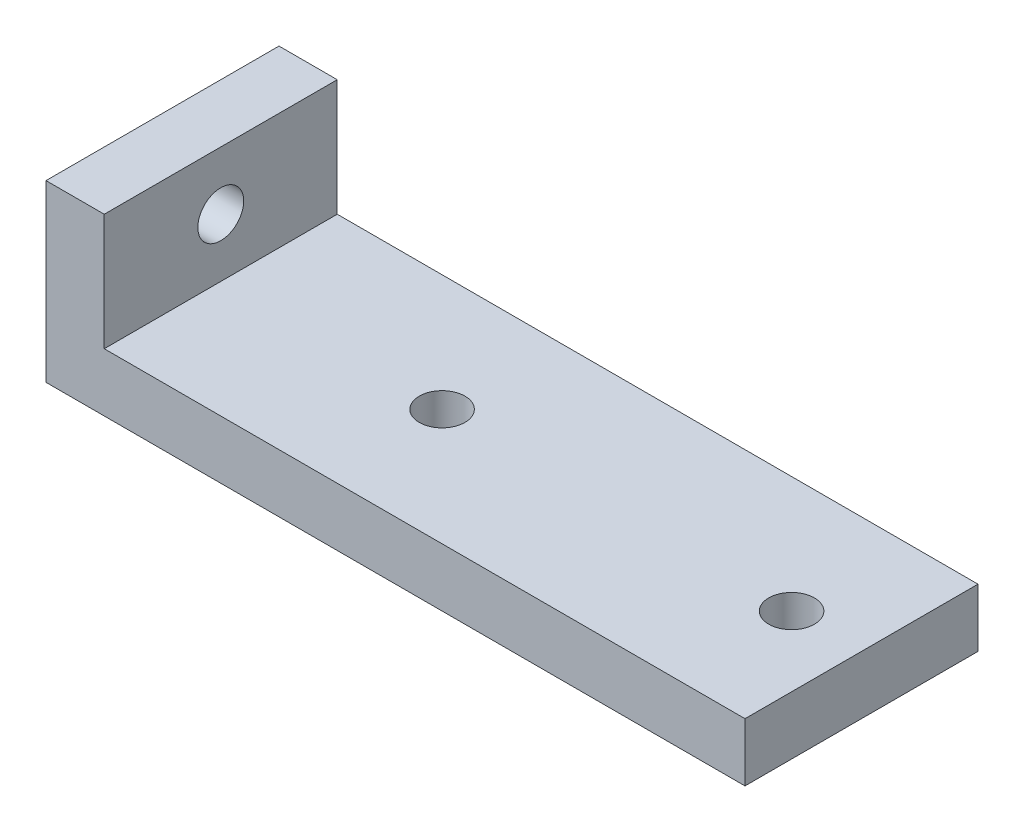
ISO-10303-21;
HEADER;
FILE_DESCRIPTION(('STEP AP214'),'2;1');
FILE_NAME('part.step','',(''),(''),'','','');
FILE_SCHEMA(('AUTOMOTIVE_DESIGN { 1 0 10303 214 1 1 1 1 }'));
ENDSEC;
DATA;
#1=APPLICATION_CONTEXT('core data for automotive mechanical design processes');
#2=APPLICATION_PROTOCOL_DEFINITION('international standard','automotive_design',2000,#1);
#3=PRODUCT_CONTEXT('',#1,'mechanical');
#4=PRODUCT('Part','Part','',(#3));
#5=PRODUCT_RELATED_PRODUCT_CATEGORY('part','',(#4));
#6=PRODUCT_DEFINITION_FORMATION('','',#4);
#7=PRODUCT_DEFINITION_CONTEXT('part definition',#1,'design');
#8=PRODUCT_DEFINITION('design','',#6,#7);
#9=PRODUCT_DEFINITION_SHAPE('','',#8);
#10=(LENGTH_UNIT() NAMED_UNIT(*) SI_UNIT(.MILLI.,.METRE.));
#11=(NAMED_UNIT(*) PLANE_ANGLE_UNIT() SI_UNIT($,.RADIAN.));
#12=(NAMED_UNIT(*) SI_UNIT($,.STERADIAN.) SOLID_ANGLE_UNIT());
#13=UNCERTAINTY_MEASURE_WITH_UNIT(LENGTH_MEASURE(1.E-05),#10,'distance_accuracy_value','');
#14=(GEOMETRIC_REPRESENTATION_CONTEXT(3) GLOBAL_UNCERTAINTY_ASSIGNED_CONTEXT((#13)) GLOBAL_UNIT_ASSIGNED_CONTEXT((#10,
#11,#12)) REPRESENTATION_CONTEXT('',''));
#15=CARTESIAN_POINT('',(0.,0.,0.));
#16=DIRECTION('',(0.,0.,1.));
#17=DIRECTION('',(1.,0.,0.));
#18=AXIS2_PLACEMENT_3D('',#15,#16,#17);
#19=CARTESIAN_POINT('',(0.,19.05,0.));
#20=DIRECTION('',(-1.,0.,0.));
#21=DIRECTION('',(0.,0.,1.));
#22=AXIS2_PLACEMENT_3D('',#19,#20,#21);
#23=PLANE('',#22);
#24=DIRECTION('',(0.,-1.,0.));
#25=VECTOR('',#24,1.);
#26=CARTESIAN_POINT('',(0.,19.05,-25.4));
#27=LINE('',#26,#25);
#28=CARTESIAN_POINT('',(0.,6.35,-25.4));
#29=VERTEX_POINT('',#28);
#30=CARTESIAN_POINT('',(0.,0.,-25.4));
#31=VERTEX_POINT('',#30);
#32=EDGE_CURVE('E11',#29,#31,#27,.T.);
#33=ORIENTED_EDGE('',*,*,#32,.F.);
#34=DIRECTION('',(0.,0.,1.));
#35=VECTOR('',#34,1.);
#36=CARTESIAN_POINT('',(0.,6.35,-25.4));
#37=LINE('',#36,#35);
#38=CARTESIAN_POINT('',(0.,6.35,0.));
#39=VERTEX_POINT('',#38);
#40=EDGE_CURVE('E83',#29,#39,#37,.T.);
#41=ORIENTED_EDGE('',*,*,#40,.T.);
#42=DIRECTION('',(0.,-1.,0.));
#43=VECTOR('',#42,1.);
#44=CARTESIAN_POINT('',(0.,19.05,0.));
#45=LINE('',#44,#43);
#46=CARTESIAN_POINT('',(0.,0.,0.));
#47=VERTEX_POINT('',#46);
#48=EDGE_CURVE('E76',#39,#47,#45,.T.);
#49=ORIENTED_EDGE('',*,*,#48,.T.);
#50=DIRECTION('',(0.,0.,-1.));
#51=VECTOR('',#50,1.);
#52=CARTESIAN_POINT('',(0.,0.,0.));
#53=LINE('',#52,#51);
#54=EDGE_CURVE('E80',#47,#31,#53,.T.);
#55=ORIENTED_EDGE('',*,*,#54,.T.);
#56=EDGE_LOOP('',(#33,#41,#49,#55));
#57=FACE_BOUND('',#56,.T.);
#58=ADVANCED_FACE('F34',(#57),#23,.F.);
#59=CARTESIAN_POINT('',(0.,19.05,-25.4));
#60=DIRECTION('',(0.,0.,1.));
#61=DIRECTION('',(1.,0.,0.));
#62=AXIS2_PLACEMENT_3D('',#59,#60,#61);
#63=PLANE('',#62);
#64=DIRECTION('',(0.,-1.,0.));
#65=VECTOR('',#64,1.);
#66=CARTESIAN_POINT('',(-69.85,19.05,-25.4));
#67=LINE('',#66,#65);
#68=CARTESIAN_POINT('',(-69.85,19.05,-25.4));
#69=VERTEX_POINT('',#68);
#70=CARTESIAN_POINT('',(-69.85,6.34999999999999,-25.4));
#71=VERTEX_POINT('',#70);
#72=EDGE_CURVE('E48',#69,#71,#67,.T.);
#73=ORIENTED_EDGE('',*,*,#72,.T.);
#74=DIRECTION('',(1.,0.,0.));
#75=VECTOR('',#74,1.);
#76=CARTESIAN_POINT('',(0.,6.35,-25.4));
#77=LINE('',#76,#75);
#78=EDGE_CURVE('E119',#71,#29,#77,.T.);
#79=ORIENTED_EDGE('',*,*,#78,.T.);
#80=ORIENTED_EDGE('',*,*,#32,.T.);
#81=DIRECTION('',(-1.,0.,0.));
#82=VECTOR('',#81,1.);
#83=CARTESIAN_POINT('',(0.,0.,-25.4));
#84=LINE('',#83,#82);
#85=CARTESIAN_POINT('',(-76.2,0.,-25.4));
#86=VERTEX_POINT('',#85);
#87=EDGE_CURVE('E101',#31,#86,#84,.T.);
#88=ORIENTED_EDGE('',*,*,#87,.T.);
#89=DIRECTION('',(0.,-1.,0.));
#90=VECTOR('',#89,1.);
#91=CARTESIAN_POINT('',(-76.2,19.05,-25.4));
#92=LINE('',#91,#90);
#93=CARTESIAN_POINT('',(-76.2,19.05,-25.4));
#94=VERTEX_POINT('',#93);
#95=EDGE_CURVE('E41',#94,#86,#92,.T.);
#96=ORIENTED_EDGE('',*,*,#95,.F.);
#97=DIRECTION('',(-1.,0.,0.));
#98=VECTOR('',#97,1.);
#99=CARTESIAN_POINT('',(0.,19.05,-25.4));
#100=LINE('',#99,#98);
#101=EDGE_CURVE('E96',#69,#94,#100,.T.);
#102=ORIENTED_EDGE('',*,*,#101,.F.);
#103=EDGE_LOOP('',(#73,#79,#80,#88,#96,#102));
#104=FACE_BOUND('',#103,.T.);
#105=ADVANCED_FACE('F116',(#104),#63,.F.);
#106=CARTESIAN_POINT('',(-76.2,19.05,0.));
#107=DIRECTION('',(1.,0.,0.));
#108=DIRECTION('',(0.,0.,-1.));
#109=AXIS2_PLACEMENT_3D('',#106,#107,#108);
#110=PLANE('',#109);
#111=CARTESIAN_POINT('',(-76.2,12.7,-12.7));
#112=DIRECTION('',(-1.,0.,0.));
#113=DIRECTION('',(0.,0.,1.));
#114=AXIS2_PLACEMENT_3D('',#111,#112,#113);
#115=CIRCLE('',#114,2.49999999999999);
#116=CARTESIAN_POINT('',(-76.2,12.7,-10.2));
#117=VERTEX_POINT('',#116);
#118=EDGE_CURVE('E149',#117,#117,#115,.T.);
#119=ORIENTED_EDGE('',*,*,#118,.F.);
#120=EDGE_LOOP('',(#119));
#121=FACE_BOUND('',#120,.T.);
#122=DIRECTION('',(0.,0.,1.));
#123=VECTOR('',#122,1.);
#124=CARTESIAN_POINT('',(-76.2,0.,0.));
#125=LINE('',#124,#123);
#126=CARTESIAN_POINT('',(-76.2,0.,0.));
#127=VERTEX_POINT('',#126);
#128=EDGE_CURVE('E97',#86,#127,#125,.T.);
#129=ORIENTED_EDGE('',*,*,#128,.T.);
#130=DIRECTION('',(0.,-1.,0.));
#131=VECTOR('',#130,1.);
#132=CARTESIAN_POINT('',(-76.2,19.05,0.));
#133=LINE('',#132,#131);
#134=CARTESIAN_POINT('',(-76.2,19.05,0.));
#135=VERTEX_POINT('',#134);
#136=EDGE_CURVE('E86',#135,#127,#133,.T.);
#137=ORIENTED_EDGE('',*,*,#136,.F.);
#138=DIRECTION('',(0.,0.,1.));
#139=VECTOR('',#138,1.);
#140=CARTESIAN_POINT('',(-76.2,19.05,0.));
#141=LINE('',#140,#139);
#142=EDGE_CURVE('E57',#94,#135,#141,.T.);
#143=ORIENTED_EDGE('',*,*,#142,.F.);
#144=ORIENTED_EDGE('',*,*,#95,.T.);
#145=EDGE_LOOP('',(#129,#137,#143,#144));
#146=FACE_BOUND('',#145,.T.);
#147=ADVANCED_FACE('F113',(#121,#146),#110,.F.);
#148=CARTESIAN_POINT('',(0.,19.05,0.));
#149=DIRECTION('',(0.,0.,-1.));
#150=DIRECTION('',(-1.,0.,0.));
#151=AXIS2_PLACEMENT_3D('',#148,#149,#150);
#152=PLANE('',#151);
#153=ORIENTED_EDGE('',*,*,#48,.F.);
#154=DIRECTION('',(1.,0.,0.));
#155=VECTOR('',#154,1.);
#156=CARTESIAN_POINT('',(0.,6.35,0.));
#157=LINE('',#156,#155);
#158=CARTESIAN_POINT('',(-69.85,6.34999999999999,0.));
#159=VERTEX_POINT('',#158);
#160=EDGE_CURVE('E130',#159,#39,#157,.T.);
#161=ORIENTED_EDGE('',*,*,#160,.F.);
#162=DIRECTION('',(0.,-1.,0.));
#163=VECTOR('',#162,1.);
#164=CARTESIAN_POINT('',(-69.85,19.05,0.));
#165=LINE('',#164,#163);
#166=CARTESIAN_POINT('',(-69.85,19.05,0.));
#167=VERTEX_POINT('',#166);
#168=EDGE_CURVE('E134',#167,#159,#165,.T.);
#169=ORIENTED_EDGE('',*,*,#168,.F.);
#170=DIRECTION('',(1.,0.,0.));
#171=VECTOR('',#170,1.);
#172=CARTESIAN_POINT('',(0.,19.05,0.));
#173=LINE('',#172,#171);
#174=EDGE_CURVE('E87',#135,#167,#173,.T.);
#175=ORIENTED_EDGE('',*,*,#174,.F.);
#176=ORIENTED_EDGE('',*,*,#136,.T.);
#177=DIRECTION('',(1.,0.,0.));
#178=VECTOR('',#177,1.);
#179=CARTESIAN_POINT('',(0.,0.,0.));
#180=LINE('',#179,#178);
#181=EDGE_CURVE('E91',#127,#47,#180,.T.);
#182=ORIENTED_EDGE('',*,*,#181,.T.);
#183=EDGE_LOOP('',(#153,#161,#169,#175,#176,#182));
#184=FACE_BOUND('',#183,.T.);
#185=ADVANCED_FACE('F92',(#184),#152,.F.);
#186=CARTESIAN_POINT('',(0.,19.05,0.));
#187=DIRECTION('',(0.,1.,0.));
#188=DIRECTION('',(0.,0.,1.));
#189=AXIS2_PLACEMENT_3D('',#186,#187,#188);
#190=PLANE('',#189);
#191=DIRECTION('',(0.,0.,1.));
#192=VECTOR('',#191,1.);
#193=CARTESIAN_POINT('',(-69.85,19.05,-25.4));
#194=LINE('',#193,#192);
#195=EDGE_CURVE('E142',#69,#167,#194,.T.);
#196=ORIENTED_EDGE('',*,*,#195,.F.);
#197=ORIENTED_EDGE('',*,*,#101,.T.);
#198=ORIENTED_EDGE('',*,*,#142,.T.);
#199=ORIENTED_EDGE('',*,*,#174,.T.);
#200=EDGE_LOOP('',(#196,#197,#198,#199));
#201=FACE_BOUND('',#200,.T.);
#202=ADVANCED_FACE('F144',(#201),#190,.T.);
#203=CARTESIAN_POINT('',(0.,0.,0.));
#204=DIRECTION('',(0.,1.,0.));
#205=DIRECTION('',(0.,0.,1.));
#206=AXIS2_PLACEMENT_3D('',#203,#204,#205);
#207=PLANE('',#206);
#208=CARTESIAN_POINT('',(-45.72,0.,-12.7));
#209=DIRECTION('',(0.,1.,0.));
#210=DIRECTION('',(0.,0.,1.));
#211=AXIS2_PLACEMENT_3D('',#208,#209,#210);
#212=CIRCLE('',#211,2.4892);
#213=CARTESIAN_POINT('',(-45.72,0.,-10.2108));
#214=VERTEX_POINT('',#213);
#215=EDGE_CURVE('E158',#214,#214,#212,.T.);
#216=ORIENTED_EDGE('',*,*,#215,.T.);
#217=EDGE_LOOP('',(#216));
#218=FACE_BOUND('',#217,.T.);
#219=CARTESIAN_POINT('',(-7.62000000000001,0.,-12.7));
#220=DIRECTION('',(0.,1.,0.));
#221=DIRECTION('',(0.,0.,1.));
#222=AXIS2_PLACEMENT_3D('',#219,#220,#221);
#223=CIRCLE('',#222,2.4892);
#224=CARTESIAN_POINT('',(-7.62000000000001,0.,-10.2108));
#225=VERTEX_POINT('',#224);
#226=EDGE_CURVE('E152',#225,#225,#223,.T.);
#227=ORIENTED_EDGE('',*,*,#226,.T.);
#228=EDGE_LOOP('',(#227));
#229=FACE_BOUND('',#228,.T.);
#230=ORIENTED_EDGE('',*,*,#54,.F.);
#231=ORIENTED_EDGE('',*,*,#181,.F.);
#232=ORIENTED_EDGE('',*,*,#128,.F.);
#233=ORIENTED_EDGE('',*,*,#87,.F.);
#234=EDGE_LOOP('',(#230,#231,#232,#233));
#235=FACE_BOUND('',#234,.T.);
#236=ADVANCED_FACE('F100',(#218,#229,#235),#207,.F.);
#237=CARTESIAN_POINT('',(0.,6.35,-25.4));
#238=DIRECTION('',(0.,-1.,0.));
#239=DIRECTION('',(1.,0.,0.));
#240=AXIS2_PLACEMENT_3D('',#237,#238,#239);
#241=PLANE('',#240);
#242=CARTESIAN_POINT('',(-45.72,6.34999999999999,-12.7));
#243=DIRECTION('',(0.,1.,0.));
#244=DIRECTION('',(0.,0.,1.));
#245=AXIS2_PLACEMENT_3D('',#242,#243,#244);
#246=CIRCLE('',#245,2.48919999999999);
#247=CARTESIAN_POINT('',(-45.72,6.34999999999999,-10.2108));
#248=VERTEX_POINT('',#247);
#249=EDGE_CURVE('E161',#248,#248,#246,.T.);
#250=ORIENTED_EDGE('',*,*,#249,.F.);
#251=EDGE_LOOP('',(#250));
#252=FACE_BOUND('',#251,.T.);
#253=CARTESIAN_POINT('',(-7.62000000000001,6.35,-12.7));
#254=DIRECTION('',(0.,1.,0.));
#255=DIRECTION('',(0.,0.,1.));
#256=AXIS2_PLACEMENT_3D('',#253,#254,#255);
#257=CIRCLE('',#256,2.48919999999999);
#258=CARTESIAN_POINT('',(-7.62000000000001,6.35,-10.2108));
#259=VERTEX_POINT('',#258);
#260=EDGE_CURVE('E155',#259,#259,#257,.T.);
#261=ORIENTED_EDGE('',*,*,#260,.F.);
#262=EDGE_LOOP('',(#261));
#263=FACE_BOUND('',#262,.T.);
#264=ORIENTED_EDGE('',*,*,#160,.T.);
#265=ORIENTED_EDGE('',*,*,#40,.F.);
#266=ORIENTED_EDGE('',*,*,#78,.F.);
#267=DIRECTION('',(0.,0.,1.));
#268=VECTOR('',#267,1.);
#269=CARTESIAN_POINT('',(-69.85,6.34999999999999,-25.4));
#270=LINE('',#269,#268);
#271=EDGE_CURVE('E104',#71,#159,#270,.T.);
#272=ORIENTED_EDGE('',*,*,#271,.T.);
#273=EDGE_LOOP('',(#264,#265,#266,#272));
#274=FACE_BOUND('',#273,.T.);
#275=ADVANCED_FACE('F131',(#252,#263,#274),#241,.F.);
#276=CARTESIAN_POINT('',(-69.85,19.05,-25.4));
#277=DIRECTION('',(-1.,0.,0.));
#278=DIRECTION('',(0.,0.,1.));
#279=AXIS2_PLACEMENT_3D('',#276,#277,#278);
#280=PLANE('',#279);
#281=CARTESIAN_POINT('',(-69.85,12.7,-12.7));
#282=DIRECTION('',(-1.,0.,0.));
#283=DIRECTION('',(0.,0.,1.));
#284=AXIS2_PLACEMENT_3D('',#281,#282,#283);
#285=CIRCLE('',#284,2.49999999999999);
#286=CARTESIAN_POINT('',(-69.85,12.7,-10.2));
#287=VERTEX_POINT('',#286);
#288=EDGE_CURVE('E137',#287,#287,#285,.T.);
#289=ORIENTED_EDGE('',*,*,#288,.T.);
#290=EDGE_LOOP('',(#289));
#291=FACE_BOUND('',#290,.T.);
#292=ORIENTED_EDGE('',*,*,#168,.T.);
#293=ORIENTED_EDGE('',*,*,#271,.F.);
#294=ORIENTED_EDGE('',*,*,#72,.F.);
#295=ORIENTED_EDGE('',*,*,#195,.T.);
#296=EDGE_LOOP('',(#292,#293,#294,#295));
#297=FACE_BOUND('',#296,.T.);
#298=ADVANCED_FACE('F145',(#291,#297),#280,.F.);
#299=CARTESIAN_POINT('',(-76.2,12.7,-12.7));
#300=DIRECTION('',(-1.,0.,0.));
#301=DIRECTION('',(0.,0.,1.));
#302=AXIS2_PLACEMENT_3D('',#299,#300,#301);
#303=CYLINDRICAL_SURFACE('',#302,2.49999999999999);
#304=ORIENTED_EDGE('',*,*,#118,.T.);
#305=EDGE_LOOP('',(#304));
#306=FACE_BOUND('',#305,.T.);
#307=ORIENTED_EDGE('',*,*,#288,.F.);
#308=EDGE_LOOP('',(#307));
#309=FACE_BOUND('',#308,.T.);
#310=ADVANCED_FACE('F174',(#306,#309),#303,.F.);
#311=CARTESIAN_POINT('',(-7.62000000000001,6.35,-12.7));
#312=DIRECTION('',(0.,1.,0.));
#313=DIRECTION('',(0.,0.,1.));
#314=AXIS2_PLACEMENT_3D('',#311,#312,#313);
#315=CYLINDRICAL_SURFACE('',#314,2.48919999999999);
#316=ORIENTED_EDGE('',*,*,#226,.F.);
#317=EDGE_LOOP('',(#316));
#318=FACE_BOUND('',#317,.T.);
#319=ORIENTED_EDGE('',*,*,#260,.T.);
#320=EDGE_LOOP('',(#319));
#321=FACE_BOUND('',#320,.T.);
#322=ADVANCED_FACE('F172',(#318,#321),#315,.F.);
#323=CARTESIAN_POINT('',(-45.72,6.34999999999999,-12.7));
#324=DIRECTION('',(0.,1.,0.));
#325=DIRECTION('',(0.,0.,1.));
#326=AXIS2_PLACEMENT_3D('',#323,#324,#325);
#327=CYLINDRICAL_SURFACE('',#326,2.48919999999999);
#328=ORIENTED_EDGE('',*,*,#215,.F.);
#329=EDGE_LOOP('',(#328));
#330=FACE_BOUND('',#329,.T.);
#331=ORIENTED_EDGE('',*,*,#249,.T.);
#332=EDGE_LOOP('',(#331));
#333=FACE_BOUND('',#332,.T.);
#334=ADVANCED_FACE('F165',(#330,#333),#327,.F.);
#335=CLOSED_SHELL('',(#58,#105,#147,#185,#202,#236,#275,#298,#310,#322,#334));
#336=MANIFOLD_SOLID_BREP('B2',#335);
#337=ADVANCED_BREP_SHAPE_REPRESENTATION('',(#18,#336),#14);
#338=SHAPE_DEFINITION_REPRESENTATION(#9,#337);
ENDSEC;
END-ISO-10303-21;
